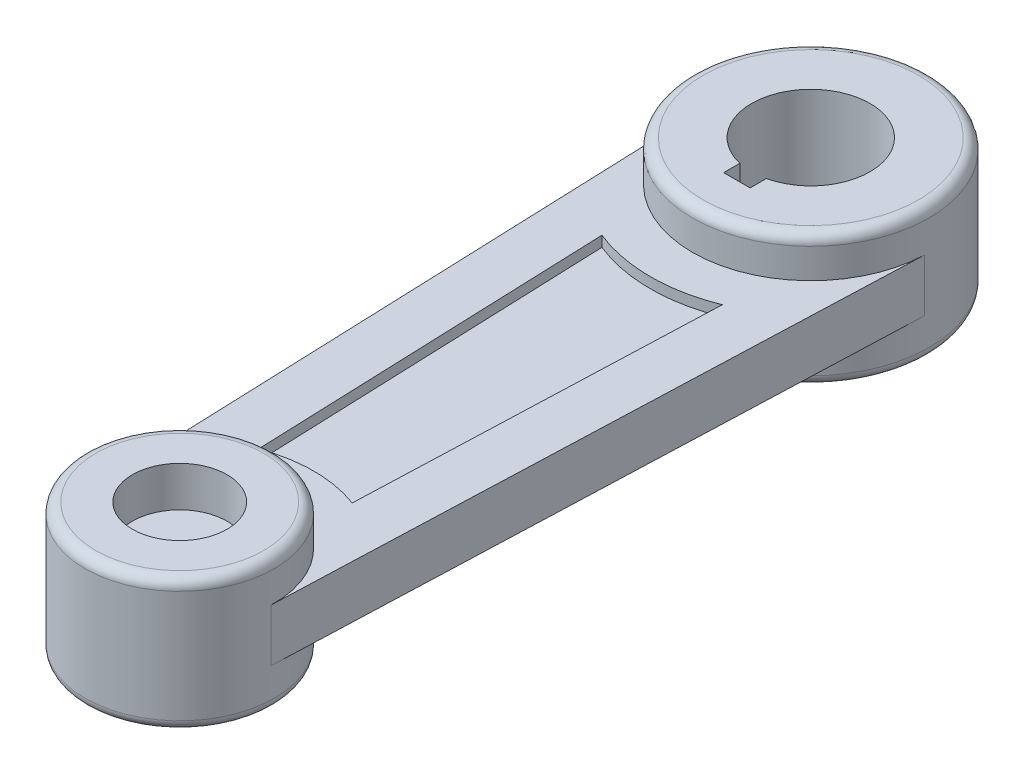
ISO-10303-21;
HEADER;
FILE_DESCRIPTION(('STEP AP214'),'2;1');
FILE_NAME('part.step','',(''),(''),'','','');
FILE_SCHEMA(('AUTOMOTIVE_DESIGN { 1 0 10303 214 1 1 1 1 }'));
ENDSEC;
DATA;
#1=APPLICATION_CONTEXT('core data for automotive mechanical design processes');
#2=APPLICATION_PROTOCOL_DEFINITION('international standard','automotive_design',2000,#1);
#3=PRODUCT_CONTEXT('',#1,'mechanical');
#4=PRODUCT('Part','Part','',(#3));
#5=PRODUCT_RELATED_PRODUCT_CATEGORY('part','',(#4));
#6=PRODUCT_DEFINITION_FORMATION('','',#4);
#7=PRODUCT_DEFINITION_CONTEXT('part definition',#1,'design');
#8=PRODUCT_DEFINITION('design','',#6,#7);
#9=PRODUCT_DEFINITION_SHAPE('','',#8);
#10=(LENGTH_UNIT() NAMED_UNIT(*) SI_UNIT(.MILLI.,.METRE.));
#11=(NAMED_UNIT(*) PLANE_ANGLE_UNIT() SI_UNIT($,.RADIAN.));
#12=(NAMED_UNIT(*) SI_UNIT($,.STERADIAN.) SOLID_ANGLE_UNIT());
#13=UNCERTAINTY_MEASURE_WITH_UNIT(LENGTH_MEASURE(1.E-05),#10,'distance_accuracy_value','');
#14=(GEOMETRIC_REPRESENTATION_CONTEXT(3) GLOBAL_UNCERTAINTY_ASSIGNED_CONTEXT((#13)) GLOBAL_UNIT_ASSIGNED_CONTEXT((#10,
#11,#12)) REPRESENTATION_CONTEXT('',''));
#15=CARTESIAN_POINT('',(0.,0.,0.));
#16=DIRECTION('',(0.,0.,1.));
#17=DIRECTION('',(1.,0.,0.));
#18=AXIS2_PLACEMENT_3D('',#15,#16,#17);
#19=CARTESIAN_POINT('',(0.,31.65,-300.));
#20=DIRECTION('',(0.,-1.,0.));
#21=DIRECTION('',(0.,0.,-1.));
#22=AXIS2_PLACEMENT_3D('',#19,#20,#21);
#23=CYLINDRICAL_SURFACE('',#22,28.15);
#24=CARTESIAN_POINT('',(0.,31.65,-300.));
#25=DIRECTION('',(0.,1.,0.));
#26=DIRECTION('',(0.,0.,1.));
#27=AXIS2_PLACEMENT_3D('',#24,#25,#26);
#28=CIRCLE('',#27,28.15);
#29=CARTESIAN_POINT('',(6.30000000000004,31.65,-272.564029085888));
#30=VERTEX_POINT('',#29);
#31=CARTESIAN_POINT('',(-6.30000000000003,31.65,-272.564029085888));
#32=VERTEX_POINT('',#31);
#33=EDGE_CURVE('E241',#30,#32,#28,.T.);
#34=ORIENTED_EDGE('',*,*,#33,.T.);
#35=DIRECTION('',(0.,1.,0.));
#36=VECTOR('',#35,1.);
#37=CARTESIAN_POINT('',(-6.30000000000003,-31.65,-272.564029085888));
#38=LINE('',#37,#36);
#39=CARTESIAN_POINT('',(-6.30000000000003,-31.65,-272.564029085888));
#40=VERTEX_POINT('',#39);
#41=EDGE_CURVE('E179',#40,#32,#38,.T.);
#42=ORIENTED_EDGE('',*,*,#41,.F.);
#43=CARTESIAN_POINT('',(0.,-31.65,-300.));
#44=DIRECTION('',(0.,1.,0.));
#45=DIRECTION('',(0.,0.,1.));
#46=AXIS2_PLACEMENT_3D('',#43,#44,#45);
#47=CIRCLE('',#46,28.15);
#48=CARTESIAN_POINT('',(6.30000000000004,-31.65,-272.564029085888));
#49=VERTEX_POINT('',#48);
#50=EDGE_CURVE('E168',#49,#40,#47,.T.);
#51=ORIENTED_EDGE('',*,*,#50,.F.);
#52=DIRECTION('',(0.,1.,0.));
#53=VECTOR('',#52,1.);
#54=CARTESIAN_POINT('',(6.30000000000004,-31.65,-272.564029085888));
#55=LINE('',#54,#53);
#56=EDGE_CURVE('E181',#49,#30,#55,.T.);
#57=ORIENTED_EDGE('',*,*,#56,.T.);
#58=EDGE_LOOP('',(#34,#42,#51,#57));
#59=FACE_BOUND('',#58,.T.);
#60=ADVANCED_FACE('F41',(#59),#23,.F.);
#61=CARTESIAN_POINT('',(0.,-12.5,0.));
#62=DIRECTION('',(0.,1.,0.));
#63=DIRECTION('',(0.,0.,1.));
#64=AXIS2_PLACEMENT_3D('',#61,#62,#63);
#65=PLANE('',#64);
#66=CARTESIAN_POINT('',(0.,-12.5,-300.));
#67=DIRECTION('',(0.,1.,0.));
#68=DIRECTION('',(0.,0.,1.));
#69=AXIS2_PLACEMENT_3D('',#66,#67,#68);
#70=CIRCLE('',#69,56.25);
#71=CARTESIAN_POINT('',(56.2104353043932,-12.5,-297.890625));
#72=VERTEX_POINT('',#71);
#73=CARTESIAN_POINT('',(-56.2104353043932,-12.5,-297.890625));
#74=VERTEX_POINT('',#73);
#75=EDGE_CURVE('E294',#72,#74,#70,.F.);
#76=ORIENTED_EDGE('',*,*,#75,.F.);
#77=DIRECTION('',(0.0375,0.,-0.999296627633657));
#78=VECTOR('',#77,1.);
#79=CARTESIAN_POINT('',(56.2104353043932,-12.5,-297.890625));
#80=LINE('',#79,#78);
#81=CARTESIAN_POINT('',(44.9683482435146,-12.5,1.6875));
#82=VERTEX_POINT('',#81);
#83=EDGE_CURVE('E255',#82,#72,#80,.T.);
#84=ORIENTED_EDGE('',*,*,#83,.F.);
#85=CARTESIAN_POINT('',(0.,-12.5,0.));
#86=DIRECTION('',(0.,1.,0.));
#87=DIRECTION('',(0.,0.,1.));
#88=AXIS2_PLACEMENT_3D('',#85,#86,#87);
#89=CIRCLE('',#88,45.);
#90=CARTESIAN_POINT('',(-44.9683482435146,-12.5,1.6875));
#91=VERTEX_POINT('',#90);
#92=EDGE_CURVE('E279',#82,#91,#89,.T.);
#93=ORIENTED_EDGE('',*,*,#92,.T.);
#94=DIRECTION('',(0.0374999999999999,0.,0.999296627633657));
#95=VECTOR('',#94,1.);
#96=CARTESIAN_POINT('',(-44.9683482435146,-12.5,1.6875));
#97=LINE('',#96,#95);
#98=EDGE_CURVE('E259',#74,#91,#97,.T.);
#99=ORIENTED_EDGE('',*,*,#98,.F.);
#100=EDGE_LOOP('',(#76,#84,#93,#99));
#101=FACE_BOUND('',#100,.T.);
#102=CARTESIAN_POINT('',(0.,-12.5,0.));
#103=DIRECTION('',(0.,-1.,0.));
#104=DIRECTION('',(0.,0.,1.));
#105=AXIS2_PLACEMENT_3D('',#102,#103,#104);
#106=CIRCLE('',#105,63.75);
#107=CARTESIAN_POINT('',(-22.2558638050738,-12.5,-59.7389238795779));
#108=VERTEX_POINT('',#107);
#109=CARTESIAN_POINT('',(22.2558638050738,-12.5,-59.7389238795779));
#110=VERTEX_POINT('',#109);
#111=EDGE_CURVE('E185',#108,#110,#106,.T.);
#112=ORIENTED_EDGE('',*,*,#111,.T.);
#113=DIRECTION('',(0.0374999999999999,0.,-0.999296627633657));
#114=VECTOR('',#113,1.);
#115=CARTESIAN_POINT('',(22.2558638050738,-12.5,-59.7389238795779));
#116=LINE('',#115,#114);
#117=CARTESIAN_POINT('',(28.6198144116936,-12.5,-229.324907336175));
#118=VERTEX_POINT('',#117);
#119=EDGE_CURVE('E187',#110,#118,#116,.T.);
#120=ORIENTED_EDGE('',*,*,#119,.T.);
#121=CARTESIAN_POINT('',(0.,-12.5,-300.));
#122=DIRECTION('',(0.,-1.,0.));
#123=DIRECTION('',(0.,0.,1.));
#124=AXIS2_PLACEMENT_3D('',#121,#122,#123);
#125=CIRCLE('',#124,76.25);
#126=CARTESIAN_POINT('',(-28.6198144116936,-12.5,-229.324907336175));
#127=VERTEX_POINT('',#126);
#128=EDGE_CURVE('E205',#118,#127,#125,.T.);
#129=ORIENTED_EDGE('',*,*,#128,.T.);
#130=DIRECTION('',(0.0374999999999999,0.,0.999296627633657));
#131=VECTOR('',#130,1.);
#132=CARTESIAN_POINT('',(-28.6198144116936,-12.5,-229.324907336175));
#133=LINE('',#132,#131);
#134=EDGE_CURVE('E200',#127,#108,#133,.T.);
#135=ORIENTED_EDGE('',*,*,#134,.T.);
#136=EDGE_LOOP('',(#112,#120,#129,#135));
#137=FACE_BOUND('',#136,.T.);
#138=ADVANCED_FACE('F340',(#101,#137),#65,.F.);
#139=CARTESIAN_POINT('',(0.,31.65,0.));
#140=DIRECTION('',(0.,-1.,0.));
#141=DIRECTION('',(0.,0.,-1.));
#142=AXIS2_PLACEMENT_3D('',#139,#140,#141);
#143=CYLINDRICAL_SURFACE('',#142,22.5);
#144=CARTESIAN_POINT('',(0.,-31.65,0.));
#145=DIRECTION('',(0.,1.,0.));
#146=DIRECTION('',(0.,0.,1.));
#147=AXIS2_PLACEMENT_3D('',#144,#145,#146);
#148=CIRCLE('',#147,22.5);
#149=CARTESIAN_POINT('',(0.,-31.65,22.5));
#150=VERTEX_POINT('',#149);
#151=EDGE_CURVE('E285',#150,#150,#148,.T.);
#152=ORIENTED_EDGE('',*,*,#151,.F.);
#153=EDGE_LOOP('',(#152));
#154=FACE_BOUND('',#153,.T.);
#155=CARTESIAN_POINT('',(0.,-12.5,0.));
#156=DIRECTION('',(0.,1.,0.));
#157=DIRECTION('',(0.,0.,1.));
#158=AXIS2_PLACEMENT_3D('',#155,#156,#157);
#159=CIRCLE('',#158,22.5);
#160=CARTESIAN_POINT('',(0.,-12.5,22.5));
#161=VERTEX_POINT('',#160);
#162=EDGE_CURVE('E280',#161,#161,#159,.T.);
#163=ORIENTED_EDGE('',*,*,#162,.T.);
#164=EDGE_LOOP('',(#163));
#165=FACE_BOUND('',#164,.T.);
#166=ADVANCED_FACE('F359',(#154,#165),#143,.F.);
#167=CARTESIAN_POINT('',(0.,31.65,0.));
#168=DIRECTION('',(0.,1.,0.));
#169=DIRECTION('',(0.,0.,1.));
#170=AXIS2_PLACEMENT_3D('',#167,#168,#169);
#171=PLANE('',#170);
#172=CARTESIAN_POINT('',(0.,31.65,0.));
#173=DIRECTION('',(0.,1.,0.));
#174=DIRECTION('',(0.,0.,1.));
#175=AXIS2_PLACEMENT_3D('',#172,#173,#174);
#176=CIRCLE('',#175,40.);
#177=CARTESIAN_POINT('',(0.,31.65,40.));
#178=VERTEX_POINT('',#177);
#179=EDGE_CURVE('E296',#178,#178,#176,.T.);
#180=ORIENTED_EDGE('',*,*,#179,.T.);
#181=EDGE_LOOP('',(#180));
#182=FACE_BOUND('',#181,.T.);
#183=CARTESIAN_POINT('',(0.,31.65,0.));
#184=DIRECTION('',(0.,1.,0.));
#185=DIRECTION('',(0.,0.,1.));
#186=AXIS2_PLACEMENT_3D('',#183,#184,#185);
#187=CIRCLE('',#186,22.5);
#188=CARTESIAN_POINT('',(0.,31.65,22.5));
#189=VERTEX_POINT('',#188);
#190=EDGE_CURVE('E283',#189,#189,#187,.T.);
#191=ORIENTED_EDGE('',*,*,#190,.F.);
#192=EDGE_LOOP('',(#191));
#193=FACE_BOUND('',#192,.T.);
#194=ADVANCED_FACE('F363',(#182,#193),#171,.T.);
#195=CARTESIAN_POINT('',(0.,-31.65,0.));
#196=DIRECTION('',(0.,1.,0.));
#197=DIRECTION('',(0.,0.,1.));
#198=AXIS2_PLACEMENT_3D('',#195,#196,#197);
#199=PLANE('',#198);
#200=CARTESIAN_POINT('',(0.,-31.65,0.));
#201=DIRECTION('',(0.,1.,0.));
#202=DIRECTION('',(0.,0.,1.));
#203=AXIS2_PLACEMENT_3D('',#200,#201,#202);
#204=CIRCLE('',#203,40.);
#205=CARTESIAN_POINT('',(0.,-31.65,40.));
#206=VERTEX_POINT('',#205);
#207=EDGE_CURVE('E308',#206,#206,#204,.F.);
#208=ORIENTED_EDGE('',*,*,#207,.T.);
#209=EDGE_LOOP('',(#208));
#210=FACE_BOUND('',#209,.T.);
#211=ORIENTED_EDGE('',*,*,#151,.T.);
#212=EDGE_LOOP('',(#211));
#213=FACE_BOUND('',#212,.T.);
#214=ADVANCED_FACE('F348',(#210,#213),#199,.F.);
#215=CARTESIAN_POINT('',(0.,31.65,0.));
#216=DIRECTION('',(0.,-1.,0.));
#217=DIRECTION('',(0.,0.,-1.));
#218=AXIS2_PLACEMENT_3D('',#215,#216,#217);
#219=CYLINDRICAL_SURFACE('',#218,45.);
#220=CARTESIAN_POINT('',(0.,26.65,0.));
#221=DIRECTION('',(0.,1.,0.));
#222=DIRECTION('',(0.,0.,1.));
#223=AXIS2_PLACEMENT_3D('',#220,#221,#222);
#224=CIRCLE('',#223,45.);
#225=CARTESIAN_POINT('',(0.,26.65,45.));
#226=VERTEX_POINT('',#225);
#227=EDGE_CURVE('E303',#226,#226,#224,.F.);
#228=ORIENTED_EDGE('',*,*,#227,.T.);
#229=EDGE_LOOP('',(#228));
#230=FACE_BOUND('',#229,.T.);
#231=CARTESIAN_POINT('',(0.,-26.65,0.));
#232=DIRECTION('',(0.,1.,0.));
#233=DIRECTION('',(0.,0.,1.));
#234=AXIS2_PLACEMENT_3D('',#231,#232,#233);
#235=CIRCLE('',#234,45.);
#236=CARTESIAN_POINT('',(0.,-26.65,45.));
#237=VERTEX_POINT('',#236);
#238=EDGE_CURVE('E297',#237,#237,#235,.T.);
#239=ORIENTED_EDGE('',*,*,#238,.T.);
#240=EDGE_LOOP('',(#239));
#241=FACE_BOUND('',#240,.T.);
#242=CARTESIAN_POINT('',(0.,12.5,0.));
#243=DIRECTION('',(0.,1.,0.));
#244=DIRECTION('',(0.,0.,1.));
#245=AXIS2_PLACEMENT_3D('',#242,#243,#244);
#246=CIRCLE('',#245,45.);
#247=CARTESIAN_POINT('',(44.9683482435146,12.5,1.6875));
#248=VERTEX_POINT('',#247);
#249=CARTESIAN_POINT('',(-44.9683482435146,12.5,1.6875));
#250=VERTEX_POINT('',#249);
#251=EDGE_CURVE('E284',#248,#250,#246,.T.);
#252=ORIENTED_EDGE('',*,*,#251,.T.);
#253=DIRECTION('',(0.,-1.,0.));
#254=VECTOR('',#253,1.);
#255=CARTESIAN_POINT('',(-44.9683482435146,12.5,1.6875));
#256=LINE('',#255,#254);
#257=EDGE_CURVE('E265',#250,#91,#256,.T.);
#258=ORIENTED_EDGE('',*,*,#257,.T.);
#259=ORIENTED_EDGE('',*,*,#92,.F.);
#260=DIRECTION('',(0.,-1.,0.));
#261=VECTOR('',#260,1.);
#262=CARTESIAN_POINT('',(44.9683482435146,12.5,1.6875));
#263=LINE('',#262,#261);
#264=EDGE_CURVE('E273',#248,#82,#263,.T.);
#265=ORIENTED_EDGE('',*,*,#264,.F.);
#266=EDGE_LOOP('',(#252,#258,#259,#265));
#267=FACE_BOUND('',#266,.T.);
#268=ADVANCED_FACE('F350',(#230,#241,#267),#219,.T.);
#269=CARTESIAN_POINT('',(0.,12.5,0.));
#270=DIRECTION('',(0.,1.,0.));
#271=DIRECTION('',(0.,0.,1.));
#272=AXIS2_PLACEMENT_3D('',#269,#270,#271);
#273=CIRCLE('',#272,22.5);
#274=CARTESIAN_POINT('',(0.,12.5,22.5));
#275=VERTEX_POINT('',#274);
#276=EDGE_CURVE('E290',#275,#275,#273,.T.);
#277=ORIENTED_EDGE('',*,*,#276,.F.);
#278=EDGE_LOOP('',(#277));
#279=FACE_BOUND('',#278,.T.);
#280=ORIENTED_EDGE('',*,*,#190,.T.);
#281=EDGE_LOOP('',(#280));
#282=FACE_BOUND('',#281,.T.);
#283=ADVANCED_FACE('F349',(#279,#282),#143,.F.);
#284=ORIENTED_EDGE('',*,*,#162,.F.);
#285=EDGE_LOOP('',(#284));
#286=FACE_BOUND('',#285,.T.);
#287=ADVANCED_FACE('F360',(#286),#65,.F.);
#288=CARTESIAN_POINT('',(0.,12.5,0.));
#289=DIRECTION('',(0.,1.,0.));
#290=DIRECTION('',(0.,0.,1.));
#291=AXIS2_PLACEMENT_3D('',#288,#289,#290);
#292=PLANE('',#291);
#293=ORIENTED_EDGE('',*,*,#276,.T.);
#294=EDGE_LOOP('',(#293));
#295=FACE_BOUND('',#294,.T.);
#296=ADVANCED_FACE('F381',(#295),#292,.T.);
#297=CARTESIAN_POINT('',(56.2104353043932,12.5,-297.890625));
#298=DIRECTION('',(-0.999296627633657,0.,-0.0375));
#299=DIRECTION('',(-0.0375,0.,0.999296627633657));
#300=AXIS2_PLACEMENT_3D('',#297,#298,#299);
#301=PLANE('',#300);
#302=ORIENTED_EDGE('',*,*,#83,.T.);
#303=DIRECTION('',(0.,-1.,0.));
#304=VECTOR('',#303,1.);
#305=CARTESIAN_POINT('',(56.2104353043932,12.5,-297.890625));
#306=LINE('',#305,#304);
#307=CARTESIAN_POINT('',(56.2104353043932,12.5,-297.890625));
#308=VERTEX_POINT('',#307);
#309=EDGE_CURVE('E271',#308,#72,#306,.T.);
#310=ORIENTED_EDGE('',*,*,#309,.F.);
#311=DIRECTION('',(0.0375,0.,-0.999296627633657));
#312=VECTOR('',#311,1.);
#313=CARTESIAN_POINT('',(56.2104353043932,12.5,-297.890625));
#314=LINE('',#313,#312);
#315=EDGE_CURVE('E254',#248,#308,#314,.T.);
#316=ORIENTED_EDGE('',*,*,#315,.F.);
#317=ORIENTED_EDGE('',*,*,#264,.T.);
#318=EDGE_LOOP('',(#302,#310,#316,#317));
#319=FACE_BOUND('',#318,.T.);
#320=ADVANCED_FACE('F327',(#319),#301,.F.);
#321=CARTESIAN_POINT('',(0.,12.5,-300.));
#322=DIRECTION('',(0.,-1.,0.));
#323=DIRECTION('',(0.,0.,-1.));
#324=AXIS2_PLACEMENT_3D('',#321,#322,#323);
#325=CYLINDRICAL_SURFACE('',#324,56.25);
#326=CARTESIAN_POINT('',(0.,-26.65,-300.));
#327=DIRECTION('',(0.,1.,0.));
#328=DIRECTION('',(0.,0.,1.));
#329=AXIS2_PLACEMENT_3D('',#326,#327,#328);
#330=CIRCLE('',#329,56.25);
#331=CARTESIAN_POINT('',(0.,-26.65,-243.75));
#332=VERTEX_POINT('',#331);
#333=EDGE_CURVE('E315',#332,#332,#330,.T.);
#334=ORIENTED_EDGE('',*,*,#333,.T.);
#335=EDGE_LOOP('',(#334));
#336=FACE_BOUND('',#335,.T.);
#337=CARTESIAN_POINT('',(0.,26.65,-300.));
#338=DIRECTION('',(0.,1.,0.));
#339=DIRECTION('',(0.,0.,1.));
#340=AXIS2_PLACEMENT_3D('',#337,#338,#339);
#341=CIRCLE('',#340,56.25);
#342=CARTESIAN_POINT('',(0.,26.65,-243.75));
#343=VERTEX_POINT('',#342);
#344=EDGE_CURVE('E310',#343,#343,#341,.F.);
#345=ORIENTED_EDGE('',*,*,#344,.T.);
#346=EDGE_LOOP('',(#345));
#347=FACE_BOUND('',#346,.T.);
#348=ORIENTED_EDGE('',*,*,#309,.T.);
#349=ORIENTED_EDGE('',*,*,#75,.T.);
#350=DIRECTION('',(0.,-1.,0.));
#351=VECTOR('',#350,1.);
#352=CARTESIAN_POINT('',(-56.2104353043932,12.5,-297.890625));
#353=LINE('',#352,#351);
#354=CARTESIAN_POINT('',(-56.2104353043932,12.5,-297.890625));
#355=VERTEX_POINT('',#354);
#356=EDGE_CURVE('E268',#355,#74,#353,.T.);
#357=ORIENTED_EDGE('',*,*,#356,.F.);
#358=CARTESIAN_POINT('',(0.,12.5,-300.));
#359=DIRECTION('',(0.,1.,0.));
#360=DIRECTION('',(0.,0.,1.));
#361=AXIS2_PLACEMENT_3D('',#358,#359,#360);
#362=CIRCLE('',#361,56.25);
#363=EDGE_CURVE('E249',#308,#355,#362,.F.);
#364=ORIENTED_EDGE('',*,*,#363,.F.);
#365=EDGE_LOOP('',(#348,#349,#357,#364));
#366=FACE_BOUND('',#365,.T.);
#367=ADVANCED_FACE('F322',(#336,#347,#366),#325,.T.);
#368=CARTESIAN_POINT('',(-44.9683482435146,12.5,1.6875));
#369=DIRECTION('',(0.999296627633657,0.,-0.0374999999999999));
#370=DIRECTION('',(-0.0374999999999999,0.,-0.999296627633657));
#371=AXIS2_PLACEMENT_3D('',#368,#369,#370);
#372=PLANE('',#371);
#373=ORIENTED_EDGE('',*,*,#98,.T.);
#374=ORIENTED_EDGE('',*,*,#257,.F.);
#375=DIRECTION('',(0.0374999999999999,0.,0.999296627633657));
#376=VECTOR('',#375,1.);
#377=CARTESIAN_POINT('',(-44.9683482435146,12.5,1.6875));
#378=LINE('',#377,#376);
#379=EDGE_CURVE('E256',#355,#250,#378,.T.);
#380=ORIENTED_EDGE('',*,*,#379,.F.);
#381=ORIENTED_EDGE('',*,*,#356,.T.);
#382=EDGE_LOOP('',(#373,#374,#380,#381));
#383=FACE_BOUND('',#382,.T.);
#384=ADVANCED_FACE('F330',(#383),#372,.F.);
#385=CARTESIAN_POINT('',(0.,12.5,0.));
#386=DIRECTION('',(0.,-1.,0.));
#387=DIRECTION('',(0.,0.,1.));
#388=AXIS2_PLACEMENT_3D('',#385,#386,#387);
#389=CIRCLE('',#388,63.75);
#390=CARTESIAN_POINT('',(-22.2558638050738,12.5,-59.7389238795779));
#391=VERTEX_POINT('',#390);
#392=CARTESIAN_POINT('',(22.2558638050738,12.5,-59.7389238795779));
#393=VERTEX_POINT('',#392);
#394=EDGE_CURVE('E209',#391,#393,#389,.T.);
#395=ORIENTED_EDGE('',*,*,#394,.F.);
#396=DIRECTION('',(0.0374999999999999,0.,0.999296627633657));
#397=VECTOR('',#396,1.);
#398=CARTESIAN_POINT('',(-28.6198144116936,12.5,-229.324907336175));
#399=LINE('',#398,#397);
#400=CARTESIAN_POINT('',(-28.6198144116936,12.5,-229.324907336175));
#401=VERTEX_POINT('',#400);
#402=EDGE_CURVE('E222',#401,#391,#399,.T.);
#403=ORIENTED_EDGE('',*,*,#402,.F.);
#404=CARTESIAN_POINT('',(0.,12.5,-300.));
#405=DIRECTION('',(0.,-1.,0.));
#406=DIRECTION('',(0.,0.,1.));
#407=AXIS2_PLACEMENT_3D('',#404,#405,#406);
#408=CIRCLE('',#407,76.25);
#409=CARTESIAN_POINT('',(28.6198144116936,12.5,-229.324907336175));
#410=VERTEX_POINT('',#409);
#411=EDGE_CURVE('E234',#410,#401,#408,.T.);
#412=ORIENTED_EDGE('',*,*,#411,.F.);
#413=DIRECTION('',(0.0374999999999999,0.,-0.999296627633657));
#414=VECTOR('',#413,1.);
#415=CARTESIAN_POINT('',(22.2558638050738,12.5,-59.7389238795779));
#416=LINE('',#415,#414);
#417=EDGE_CURVE('E235',#393,#410,#416,.T.);
#418=ORIENTED_EDGE('',*,*,#417,.F.);
#419=EDGE_LOOP('',(#395,#403,#412,#418));
#420=FACE_BOUND('',#419,.T.);
#421=ORIENTED_EDGE('',*,*,#315,.T.);
#422=ORIENTED_EDGE('',*,*,#363,.T.);
#423=ORIENTED_EDGE('',*,*,#379,.T.);
#424=ORIENTED_EDGE('',*,*,#251,.F.);
#425=EDGE_LOOP('',(#421,#422,#423,#424));
#426=FACE_BOUND('',#425,.T.);
#427=ADVANCED_FACE('F344',(#420,#426),#292,.T.);
#428=CARTESIAN_POINT('',(0.,-31.65,-300.));
#429=DIRECTION('',(0.,1.,0.));
#430=DIRECTION('',(0.,0.,1.));
#431=AXIS2_PLACEMENT_3D('',#428,#429,#430);
#432=PLANE('',#431);
#433=CARTESIAN_POINT('',(0.,-31.65,-300.));
#434=DIRECTION('',(0.,1.,0.));
#435=DIRECTION('',(0.,0.,1.));
#436=AXIS2_PLACEMENT_3D('',#433,#434,#435);
#437=CIRCLE('',#436,51.25);
#438=CARTESIAN_POINT('',(0.,-31.65,-248.75));
#439=VERTEX_POINT('',#438);
#440=EDGE_CURVE('E47',#439,#439,#437,.F.);
#441=ORIENTED_EDGE('',*,*,#440,.T.);
#442=EDGE_LOOP('',(#441));
#443=FACE_BOUND('',#442,.T.);
#444=ORIENTED_EDGE('',*,*,#50,.T.);
#445=DIRECTION('',(0.,0.,1.));
#446=VECTOR('',#445,1.);
#447=CARTESIAN_POINT('',(-6.30000000000003,-31.65,-272.564029085888));
#448=LINE('',#447,#446);
#449=CARTESIAN_POINT('',(-6.29999999999997,-31.65,-264.864029085888));
#450=VERTEX_POINT('',#449);
#451=EDGE_CURVE('E154',#40,#450,#448,.T.);
#452=ORIENTED_EDGE('',*,*,#451,.T.);
#453=DIRECTION('',(1.,0.,0.));
#454=VECTOR('',#453,1.);
#455=CARTESIAN_POINT('',(6.30000000000004,-31.65,-264.864029085888));
#456=LINE('',#455,#454);
#457=CARTESIAN_POINT('',(6.30000000000004,-31.65,-264.864029085888));
#458=VERTEX_POINT('',#457);
#459=EDGE_CURVE('E162',#450,#458,#456,.T.);
#460=ORIENTED_EDGE('',*,*,#459,.T.);
#461=DIRECTION('',(0.,0.,-1.));
#462=VECTOR('',#461,1.);
#463=CARTESIAN_POINT('',(6.30000000000004,-31.65,-272.564029085888));
#464=LINE('',#463,#462);
#465=EDGE_CURVE('E57',#458,#49,#464,.T.);
#466=ORIENTED_EDGE('',*,*,#465,.T.);
#467=EDGE_LOOP('',(#444,#452,#460,#466));
#468=FACE_BOUND('',#467,.T.);
#469=ADVANCED_FACE('F169',(#443,#468),#432,.F.);
#470=CARTESIAN_POINT('',(0.,31.65,-300.));
#471=DIRECTION('',(0.,1.,0.));
#472=DIRECTION('',(0.,0.,1.));
#473=AXIS2_PLACEMENT_3D('',#470,#471,#472);
#474=PLANE('',#473);
#475=CARTESIAN_POINT('',(0.,31.65,-300.));
#476=DIRECTION('',(0.,1.,0.));
#477=DIRECTION('',(0.,0.,1.));
#478=AXIS2_PLACEMENT_3D('',#475,#476,#477);
#479=CIRCLE('',#478,51.25);
#480=CARTESIAN_POINT('',(0.,31.65,-248.75));
#481=VERTEX_POINT('',#480);
#482=EDGE_CURVE('E11',#481,#481,#479,.T.);
#483=ORIENTED_EDGE('',*,*,#482,.T.);
#484=EDGE_LOOP('',(#483));
#485=FACE_BOUND('',#484,.T.);
#486=DIRECTION('',(0.,0.,1.));
#487=VECTOR('',#486,1.);
#488=CARTESIAN_POINT('',(-6.30000000000003,31.65,-272.564029085888));
#489=LINE('',#488,#487);
#490=CARTESIAN_POINT('',(-6.29999999999997,31.65,-264.864029085888));
#491=VERTEX_POINT('',#490);
#492=EDGE_CURVE('E63',#32,#491,#489,.T.);
#493=ORIENTED_EDGE('',*,*,#492,.F.);
#494=ORIENTED_EDGE('',*,*,#33,.F.);
#495=DIRECTION('',(0.,0.,-1.));
#496=VECTOR('',#495,1.);
#497=CARTESIAN_POINT('',(6.30000000000004,31.65,-272.564029085888));
#498=LINE('',#497,#496);
#499=CARTESIAN_POINT('',(6.30000000000004,31.65,-264.864029085888));
#500=VERTEX_POINT('',#499);
#501=EDGE_CURVE('E174',#500,#30,#498,.T.);
#502=ORIENTED_EDGE('',*,*,#501,.F.);
#503=DIRECTION('',(1.,0.,0.));
#504=VECTOR('',#503,1.);
#505=CARTESIAN_POINT('',(6.30000000000004,31.65,-264.864029085888));
#506=LINE('',#505,#504);
#507=EDGE_CURVE('E173',#491,#500,#506,.T.);
#508=ORIENTED_EDGE('',*,*,#507,.F.);
#509=EDGE_LOOP('',(#493,#494,#502,#508));
#510=FACE_BOUND('',#509,.T.);
#511=ADVANCED_FACE('F380',(#485,#510),#474,.T.);
#512=CARTESIAN_POINT('',(0.,7.5,0.));
#513=DIRECTION('',(0.,1.,0.));
#514=DIRECTION('',(0.,0.,1.));
#515=AXIS2_PLACEMENT_3D('',#512,#513,#514);
#516=CYLINDRICAL_SURFACE('',#515,63.75);
#517=ORIENTED_EDGE('',*,*,#394,.T.);
#518=DIRECTION('',(0.,1.,0.));
#519=VECTOR('',#518,1.);
#520=CARTESIAN_POINT('',(22.2558638050738,7.5,-59.7389238795779));
#521=LINE('',#520,#519);
#522=CARTESIAN_POINT('',(22.2558638050738,7.5,-59.7389238795779));
#523=VERTEX_POINT('',#522);
#524=EDGE_CURVE('E227',#523,#393,#521,.T.);
#525=ORIENTED_EDGE('',*,*,#524,.F.);
#526=CARTESIAN_POINT('',(0.,7.5,0.));
#527=DIRECTION('',(0.,-1.,0.));
#528=DIRECTION('',(0.,0.,1.));
#529=AXIS2_PLACEMENT_3D('',#526,#527,#528);
#530=CIRCLE('',#529,63.75);
#531=CARTESIAN_POINT('',(-22.2558638050738,7.5,-59.7389238795779));
#532=VERTEX_POINT('',#531);
#533=EDGE_CURVE('E220',#532,#523,#530,.T.);
#534=ORIENTED_EDGE('',*,*,#533,.F.);
#535=DIRECTION('',(0.,1.,0.));
#536=VECTOR('',#535,1.);
#537=CARTESIAN_POINT('',(-22.2558638050738,7.5,-59.7389238795779));
#538=LINE('',#537,#536);
#539=EDGE_CURVE('E238',#532,#391,#538,.T.);
#540=ORIENTED_EDGE('',*,*,#539,.T.);
#541=EDGE_LOOP('',(#517,#525,#534,#540));
#542=FACE_BOUND('',#541,.T.);
#543=ADVANCED_FACE('F443',(#542),#516,.T.);
#544=CARTESIAN_POINT('',(-28.6198144116936,7.5,-229.324907336175));
#545=DIRECTION('',(-0.999296627633657,0.,0.0374999999999999));
#546=DIRECTION('',(0.0374999999999999,0.,0.999296627633657));
#547=AXIS2_PLACEMENT_3D('',#544,#545,#546);
#548=PLANE('',#547);
#549=ORIENTED_EDGE('',*,*,#402,.T.);
#550=ORIENTED_EDGE('',*,*,#539,.F.);
#551=DIRECTION('',(0.0374999999999999,0.,0.999296627633657));
#552=VECTOR('',#551,1.);
#553=CARTESIAN_POINT('',(-28.6198144116936,7.5,-229.324907336175));
#554=LINE('',#553,#552);
#555=CARTESIAN_POINT('',(-28.6198144116936,7.5,-229.324907336175));
#556=VERTEX_POINT('',#555);
#557=EDGE_CURVE('E226',#556,#532,#554,.T.);
#558=ORIENTED_EDGE('',*,*,#557,.F.);
#559=DIRECTION('',(0.,1.,0.));
#560=VECTOR('',#559,1.);
#561=CARTESIAN_POINT('',(-28.6198144116936,7.5,-229.324907336175));
#562=LINE('',#561,#560);
#563=EDGE_CURVE('E245',#556,#401,#562,.T.);
#564=ORIENTED_EDGE('',*,*,#563,.T.);
#565=EDGE_LOOP('',(#549,#550,#558,#564));
#566=FACE_BOUND('',#565,.T.);
#567=ADVANCED_FACE('F442',(#566),#548,.F.);
#568=CARTESIAN_POINT('',(0.,7.5,-300.));
#569=DIRECTION('',(0.,1.,0.));
#570=DIRECTION('',(0.,0.,1.));
#571=AXIS2_PLACEMENT_3D('',#568,#569,#570);
#572=CYLINDRICAL_SURFACE('',#571,76.25);
#573=ORIENTED_EDGE('',*,*,#411,.T.);
#574=ORIENTED_EDGE('',*,*,#563,.F.);
#575=CARTESIAN_POINT('',(0.,7.5,-300.));
#576=DIRECTION('',(0.,-1.,0.));
#577=DIRECTION('',(0.,0.,1.));
#578=AXIS2_PLACEMENT_3D('',#575,#576,#577);
#579=CIRCLE('',#578,76.25);
#580=CARTESIAN_POINT('',(28.6198144116936,7.5,-229.324907336175));
#581=VERTEX_POINT('',#580);
#582=EDGE_CURVE('E221',#581,#556,#579,.T.);
#583=ORIENTED_EDGE('',*,*,#582,.F.);
#584=DIRECTION('',(0.,1.,0.));
#585=VECTOR('',#584,1.);
#586=CARTESIAN_POINT('',(28.6198144116936,7.5,-229.324907336175));
#587=LINE('',#586,#585);
#588=EDGE_CURVE('E242',#581,#410,#587,.T.);
#589=ORIENTED_EDGE('',*,*,#588,.T.);
#590=EDGE_LOOP('',(#573,#574,#583,#589));
#591=FACE_BOUND('',#590,.T.);
#592=ADVANCED_FACE('F441',(#591),#572,.T.);
#593=CARTESIAN_POINT('',(22.2558638050738,7.5,-59.7389238795779));
#594=DIRECTION('',(0.999296627633657,0.,0.0374999999999999));
#595=DIRECTION('',(0.0374999999999999,0.,-0.999296627633657));
#596=AXIS2_PLACEMENT_3D('',#593,#594,#595);
#597=PLANE('',#596);
#598=ORIENTED_EDGE('',*,*,#417,.T.);
#599=ORIENTED_EDGE('',*,*,#588,.F.);
#600=DIRECTION('',(0.0374999999999999,0.,-0.999296627633657));
#601=VECTOR('',#600,1.);
#602=CARTESIAN_POINT('',(22.2558638050738,7.5,-59.7389238795779));
#603=LINE('',#602,#601);
#604=EDGE_CURVE('E219',#523,#581,#603,.T.);
#605=ORIENTED_EDGE('',*,*,#604,.F.);
#606=ORIENTED_EDGE('',*,*,#524,.T.);
#607=EDGE_LOOP('',(#598,#599,#605,#606));
#608=FACE_BOUND('',#607,.T.);
#609=ADVANCED_FACE('F438',(#608),#597,.F.);
#610=CARTESIAN_POINT('',(0.,7.5,0.));
#611=DIRECTION('',(0.,1.,0.));
#612=DIRECTION('',(0.,0.,1.));
#613=AXIS2_PLACEMENT_3D('',#610,#611,#612);
#614=PLANE('',#613);
#615=ORIENTED_EDGE('',*,*,#533,.T.);
#616=ORIENTED_EDGE('',*,*,#604,.T.);
#617=ORIENTED_EDGE('',*,*,#582,.T.);
#618=ORIENTED_EDGE('',*,*,#557,.T.);
#619=EDGE_LOOP('',(#615,#616,#617,#618));
#620=FACE_BOUND('',#619,.T.);
#621=ADVANCED_FACE('F434',(#620),#614,.T.);
#622=CARTESIAN_POINT('',(0.,-7.5,0.));
#623=DIRECTION('',(0.,-1.,0.));
#624=DIRECTION('',(0.,0.,-1.));
#625=AXIS2_PLACEMENT_3D('',#622,#623,#624);
#626=CYLINDRICAL_SURFACE('',#625,63.75);
#627=ORIENTED_EDGE('',*,*,#111,.F.);
#628=DIRECTION('',(0.,-1.,0.));
#629=VECTOR('',#628,1.);
#630=CARTESIAN_POINT('',(-22.2558638050738,-7.5,-59.7389238795779));
#631=LINE('',#630,#629);
#632=CARTESIAN_POINT('',(-22.2558638050738,-7.5,-59.7389238795779));
#633=VERTEX_POINT('',#632);
#634=EDGE_CURVE('E198',#633,#108,#631,.T.);
#635=ORIENTED_EDGE('',*,*,#634,.F.);
#636=CARTESIAN_POINT('',(0.,-7.5,0.));
#637=DIRECTION('',(0.,-1.,0.));
#638=DIRECTION('',(0.,0.,1.));
#639=AXIS2_PLACEMENT_3D('',#636,#637,#638);
#640=CIRCLE('',#639,63.75);
#641=CARTESIAN_POINT('',(22.2558638050738,-7.5,-59.7389238795779));
#642=VERTEX_POINT('',#641);
#643=EDGE_CURVE('E189',#633,#642,#640,.T.);
#644=ORIENTED_EDGE('',*,*,#643,.T.);
#645=DIRECTION('',(0.,-1.,0.));
#646=VECTOR('',#645,1.);
#647=CARTESIAN_POINT('',(22.2558638050738,-7.5,-59.7389238795779));
#648=LINE('',#647,#646);
#649=EDGE_CURVE('E210',#642,#110,#648,.T.);
#650=ORIENTED_EDGE('',*,*,#649,.T.);
#651=EDGE_LOOP('',(#627,#635,#644,#650));
#652=FACE_BOUND('',#651,.T.);
#653=ADVANCED_FACE('F422',(#652),#626,.T.);
#654=CARTESIAN_POINT('',(22.2558638050738,-7.5,-59.7389238795779));
#655=DIRECTION('',(-0.999296627633657,0.,-0.0374999999999999));
#656=DIRECTION('',(-0.0374999999999999,0.,0.999296627633657));
#657=AXIS2_PLACEMENT_3D('',#654,#655,#656);
#658=PLANE('',#657);
#659=ORIENTED_EDGE('',*,*,#119,.F.);
#660=ORIENTED_EDGE('',*,*,#649,.F.);
#661=DIRECTION('',(0.0374999999999999,0.,-0.999296627633657));
#662=VECTOR('',#661,1.);
#663=CARTESIAN_POINT('',(22.2558638050738,-7.5,-59.7389238795779));
#664=LINE('',#663,#662);
#665=CARTESIAN_POINT('',(28.6198144116936,-7.5,-229.324907336175));
#666=VERTEX_POINT('',#665);
#667=EDGE_CURVE('E192',#642,#666,#664,.T.);
#668=ORIENTED_EDGE('',*,*,#667,.T.);
#669=DIRECTION('',(0.,-1.,0.));
#670=VECTOR('',#669,1.);
#671=CARTESIAN_POINT('',(28.6198144116936,-7.5,-229.324907336175));
#672=LINE('',#671,#670);
#673=EDGE_CURVE('E211',#666,#118,#672,.T.);
#674=ORIENTED_EDGE('',*,*,#673,.T.);
#675=EDGE_LOOP('',(#659,#660,#668,#674));
#676=FACE_BOUND('',#675,.T.);
#677=ADVANCED_FACE('F423',(#676),#658,.T.);
#678=CARTESIAN_POINT('',(0.,-7.5,-300.));
#679=DIRECTION('',(0.,-1.,0.));
#680=DIRECTION('',(0.,0.,-1.));
#681=AXIS2_PLACEMENT_3D('',#678,#679,#680);
#682=CYLINDRICAL_SURFACE('',#681,76.25);
#683=ORIENTED_EDGE('',*,*,#128,.F.);
#684=ORIENTED_EDGE('',*,*,#673,.F.);
#685=CARTESIAN_POINT('',(0.,-7.5,-300.));
#686=DIRECTION('',(0.,-1.,0.));
#687=DIRECTION('',(0.,0.,1.));
#688=AXIS2_PLACEMENT_3D('',#685,#686,#687);
#689=CIRCLE('',#688,76.25);
#690=CARTESIAN_POINT('',(-28.6198144116936,-7.5,-229.324907336175));
#691=VERTEX_POINT('',#690);
#692=EDGE_CURVE('E195',#666,#691,#689,.T.);
#693=ORIENTED_EDGE('',*,*,#692,.T.);
#694=DIRECTION('',(0.,-1.,0.));
#695=VECTOR('',#694,1.);
#696=CARTESIAN_POINT('',(-28.6198144116936,-7.5,-229.324907336175));
#697=LINE('',#696,#695);
#698=EDGE_CURVE('E213',#691,#127,#697,.T.);
#699=ORIENTED_EDGE('',*,*,#698,.T.);
#700=EDGE_LOOP('',(#683,#684,#693,#699));
#701=FACE_BOUND('',#700,.T.);
#702=ADVANCED_FACE('F424',(#701),#682,.T.);
#703=CARTESIAN_POINT('',(-28.6198144116936,-7.5,-229.324907336175));
#704=DIRECTION('',(0.999296627633657,0.,-0.0374999999999999));
#705=DIRECTION('',(-0.0374999999999999,0.,-0.999296627633657));
#706=AXIS2_PLACEMENT_3D('',#703,#704,#705);
#707=PLANE('',#706);
#708=ORIENTED_EDGE('',*,*,#134,.F.);
#709=ORIENTED_EDGE('',*,*,#698,.F.);
#710=DIRECTION('',(0.0374999999999999,0.,0.999296627633657));
#711=VECTOR('',#710,1.);
#712=CARTESIAN_POINT('',(-28.6198144116936,-7.5,-229.324907336175));
#713=LINE('',#712,#711);
#714=EDGE_CURVE('E188',#691,#633,#713,.T.);
#715=ORIENTED_EDGE('',*,*,#714,.T.);
#716=ORIENTED_EDGE('',*,*,#634,.T.);
#717=EDGE_LOOP('',(#708,#709,#715,#716));
#718=FACE_BOUND('',#717,.T.);
#719=ADVANCED_FACE('F420',(#718),#707,.T.);
#720=CARTESIAN_POINT('',(0.,-7.5,0.));
#721=DIRECTION('',(0.,-1.,0.));
#722=DIRECTION('',(0.,0.,1.));
#723=AXIS2_PLACEMENT_3D('',#720,#721,#722);
#724=PLANE('',#723);
#725=ORIENTED_EDGE('',*,*,#643,.F.);
#726=ORIENTED_EDGE('',*,*,#714,.F.);
#727=ORIENTED_EDGE('',*,*,#692,.F.);
#728=ORIENTED_EDGE('',*,*,#667,.F.);
#729=EDGE_LOOP('',(#725,#726,#727,#728));
#730=FACE_BOUND('',#729,.T.);
#731=ADVANCED_FACE('F417',(#730),#724,.T.);
#732=CARTESIAN_POINT('',(-6.30000000000003,-31.65,-272.564029085888));
#733=DIRECTION('',(-1.,0.,0.));
#734=DIRECTION('',(0.,0.,1.));
#735=AXIS2_PLACEMENT_3D('',#732,#733,#734);
#736=PLANE('',#735);
#737=ORIENTED_EDGE('',*,*,#492,.T.);
#738=DIRECTION('',(0.,1.,0.));
#739=VECTOR('',#738,1.);
#740=CARTESIAN_POINT('',(-6.29999999999997,-31.65,-264.864029085888));
#741=LINE('',#740,#739);
#742=EDGE_CURVE('E151',#450,#491,#741,.T.);
#743=ORIENTED_EDGE('',*,*,#742,.F.);
#744=ORIENTED_EDGE('',*,*,#451,.F.);
#745=ORIENTED_EDGE('',*,*,#41,.T.);
#746=EDGE_LOOP('',(#737,#743,#744,#745));
#747=FACE_BOUND('',#746,.T.);
#748=ADVANCED_FACE('F153',(#747),#736,.F.);
#749=CARTESIAN_POINT('',(6.30000000000004,-31.65,-272.564029085888));
#750=DIRECTION('',(1.,0.,0.));
#751=DIRECTION('',(0.,0.,-1.));
#752=AXIS2_PLACEMENT_3D('',#749,#750,#751);
#753=PLANE('',#752);
#754=ORIENTED_EDGE('',*,*,#501,.T.);
#755=ORIENTED_EDGE('',*,*,#56,.F.);
#756=ORIENTED_EDGE('',*,*,#465,.F.);
#757=DIRECTION('',(0.,1.,0.));
#758=VECTOR('',#757,1.);
#759=CARTESIAN_POINT('',(6.30000000000004,-31.65,-264.864029085888));
#760=LINE('',#759,#758);
#761=EDGE_CURVE('E159',#458,#500,#760,.T.);
#762=ORIENTED_EDGE('',*,*,#761,.T.);
#763=EDGE_LOOP('',(#754,#755,#756,#762));
#764=FACE_BOUND('',#763,.T.);
#765=ADVANCED_FACE('F410',(#764),#753,.F.);
#766=CARTESIAN_POINT('',(6.30000000000004,-31.65,-264.864029085888));
#767=DIRECTION('',(0.,0.,1.));
#768=DIRECTION('',(1.,0.,0.));
#769=AXIS2_PLACEMENT_3D('',#766,#767,#768);
#770=PLANE('',#769);
#771=ORIENTED_EDGE('',*,*,#507,.T.);
#772=ORIENTED_EDGE('',*,*,#761,.F.);
#773=ORIENTED_EDGE('',*,*,#459,.F.);
#774=ORIENTED_EDGE('',*,*,#742,.T.);
#775=EDGE_LOOP('',(#771,#772,#773,#774));
#776=FACE_BOUND('',#775,.T.);
#777=ADVANCED_FACE('F163',(#776),#770,.F.);
#778=CARTESIAN_POINT('',(0.,26.65,0.));
#779=DIRECTION('',(0.,1.,0.));
#780=DIRECTION('',(0.,0.,1.));
#781=AXIS2_PLACEMENT_3D('',#778,#779,#780);
#782=TOROIDAL_SURFACE('',#781,40.,5.);
#783=ORIENTED_EDGE('',*,*,#227,.F.);
#784=EDGE_LOOP('',(#783));
#785=FACE_BOUND('',#784,.T.);
#786=ORIENTED_EDGE('',*,*,#179,.F.);
#787=EDGE_LOOP('',(#786));
#788=FACE_BOUND('',#787,.T.);
#789=ADVANCED_FACE('F397',(#785,#788),#782,.T.);
#790=CARTESIAN_POINT('',(0.,-26.65,0.));
#791=DIRECTION('',(0.,1.,0.));
#792=DIRECTION('',(0.,0.,1.));
#793=AXIS2_PLACEMENT_3D('',#790,#791,#792);
#794=TOROIDAL_SURFACE('',#793,40.,5.);
#795=ORIENTED_EDGE('',*,*,#207,.F.);
#796=EDGE_LOOP('',(#795));
#797=FACE_BOUND('',#796,.T.);
#798=ORIENTED_EDGE('',*,*,#238,.F.);
#799=EDGE_LOOP('',(#798));
#800=FACE_BOUND('',#799,.T.);
#801=ADVANCED_FACE('F321',(#797,#800),#794,.T.);
#802=CARTESIAN_POINT('',(0.,-26.65,-300.));
#803=DIRECTION('',(0.,1.,0.));
#804=DIRECTION('',(0.,0.,1.));
#805=AXIS2_PLACEMENT_3D('',#802,#803,#804);
#806=TOROIDAL_SURFACE('',#805,51.25,5.);
#807=ORIENTED_EDGE('',*,*,#440,.F.);
#808=EDGE_LOOP('',(#807));
#809=FACE_BOUND('',#808,.T.);
#810=ORIENTED_EDGE('',*,*,#333,.F.);
#811=EDGE_LOOP('',(#810));
#812=FACE_BOUND('',#811,.T.);
#813=ADVANCED_FACE('F318',(#809,#812),#806,.T.);
#814=CARTESIAN_POINT('',(0.,26.65,-300.));
#815=DIRECTION('',(0.,1.,0.));
#816=DIRECTION('',(0.,0.,1.));
#817=AXIS2_PLACEMENT_3D('',#814,#815,#816);
#818=TOROIDAL_SURFACE('',#817,51.25,5.);
#819=ORIENTED_EDGE('',*,*,#344,.F.);
#820=EDGE_LOOP('',(#819));
#821=FACE_BOUND('',#820,.T.);
#822=ORIENTED_EDGE('',*,*,#482,.F.);
#823=EDGE_LOOP('',(#822));
#824=FACE_BOUND('',#823,.T.);
#825=ADVANCED_FACE('F43',(#821,#824),#818,.T.);
#826=CLOSED_SHELL('',(#60,#138,#166,#194,#214,#268,#283,#287,#296,#320,#367,#384,#427,#469,#511,
#543,#567,#592,#609,#621,#653,#677,#702,#719,#731,#748,#765,#777,#789,#801,#813,#825));
#827=MANIFOLD_SOLID_BREP('B2',#826);
#828=ADVANCED_BREP_SHAPE_REPRESENTATION('',(#18,#827),#14);
#829=SHAPE_DEFINITION_REPRESENTATION(#9,#828);
ENDSEC;
END-ISO-10303-21;
